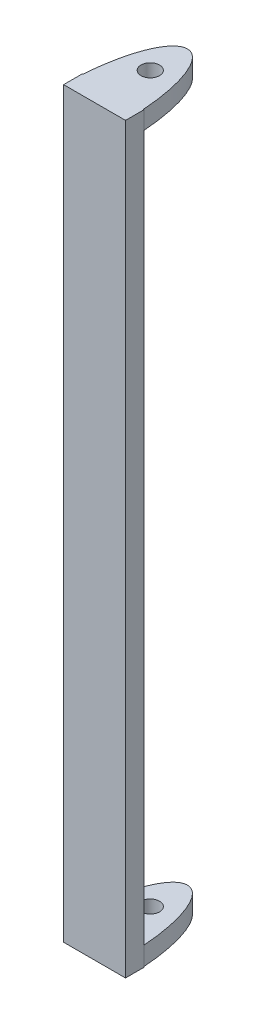
ISO-10303-21;
HEADER;
FILE_DESCRIPTION(('STEP AP214'),'2;1');
FILE_NAME('part.step','',(''),(''),'','','');
FILE_SCHEMA(('AUTOMOTIVE_DESIGN { 1 0 10303 214 1 1 1 1 }'));
ENDSEC;
DATA;
#1=APPLICATION_CONTEXT('core data for automotive mechanical design processes');
#2=APPLICATION_PROTOCOL_DEFINITION('international standard','automotive_design',2000,#1);
#3=PRODUCT_CONTEXT('',#1,'mechanical');
#4=PRODUCT('Part','Part','',(#3));
#5=PRODUCT_RELATED_PRODUCT_CATEGORY('part','',(#4));
#6=PRODUCT_DEFINITION_FORMATION('','',#4);
#7=PRODUCT_DEFINITION_CONTEXT('part definition',#1,'design');
#8=PRODUCT_DEFINITION('design','',#6,#7);
#9=PRODUCT_DEFINITION_SHAPE('','',#8);
#10=(LENGTH_UNIT() NAMED_UNIT(*) SI_UNIT(.MILLI.,.METRE.));
#11=(NAMED_UNIT(*) PLANE_ANGLE_UNIT() SI_UNIT($,.RADIAN.));
#12=(NAMED_UNIT(*) SI_UNIT($,.STERADIAN.) SOLID_ANGLE_UNIT());
#13=UNCERTAINTY_MEASURE_WITH_UNIT(LENGTH_MEASURE(1.E-05),#10,'distance_accuracy_value','');
#14=(GEOMETRIC_REPRESENTATION_CONTEXT(3) GLOBAL_UNCERTAINTY_ASSIGNED_CONTEXT((#13)) GLOBAL_UNIT_ASSIGNED_CONTEXT((#10,
#11,#12)) REPRESENTATION_CONTEXT('',''));
#15=CARTESIAN_POINT('',(0.,0.,0.));
#16=DIRECTION('',(0.,0.,1.));
#17=DIRECTION('',(1.,0.,0.));
#18=AXIS2_PLACEMENT_3D('',#15,#16,#17);
#19=CARTESIAN_POINT('',(5.,3.,0.));
#20=DIRECTION('',(0.,1.,0.));
#21=DIRECTION('',(0.,0.,-1.));
#22=AXIS2_PLACEMENT_3D('',#19,#20,#21);
#23=ELLIPSE('',#22,15.,5.);
#24=DIRECTION('',(0.,-1.,0.));
#25=VECTOR('',#24,1.);
#26=SURFACE_OF_LINEAR_EXTRUSION('',#23,#25);
#27=CARTESIAN_POINT('',(5.,0.,0.));
#28=DIRECTION('',(0.,1.,0.));
#29=DIRECTION('',(0.,0.,-1.));
#30=AXIS2_PLACEMENT_3D('',#27,#28,#29);
#31=ELLIPSE('',#30,15.,5.);
#32=CARTESIAN_POINT('',(9.89897948556636,0.,-3.));
#33=VERTEX_POINT('',#32);
#34=CARTESIAN_POINT('',(0.101020514433644,0.,-3.));
#35=VERTEX_POINT('',#34);
#36=EDGE_CURVE('E173',#33,#35,#31,.T.);
#37=ORIENTED_EDGE('',*,*,#36,.T.);
#38=DIRECTION('',(0.,-1.,0.));
#39=VECTOR('',#38,1.);
#40=CARTESIAN_POINT('',(0.101020514433644,3.,-3.));
#41=LINE('',#40,#39);
#42=CARTESIAN_POINT('',(0.101020514433644,3.,-3.));
#43=VERTEX_POINT('',#42);
#44=EDGE_CURVE('E64',#35,#43,#41,.F.);
#45=ORIENTED_EDGE('',*,*,#44,.T.);
#46=CARTESIAN_POINT('',(9.89897948556636,3.,-3.));
#47=VERTEX_POINT('',#46);
#48=EDGE_CURVE('E176',#47,#43,#23,.T.);
#49=ORIENTED_EDGE('',*,*,#48,.F.);
#50=DIRECTION('',(0.,-1.,0.));
#51=VECTOR('',#50,1.);
#52=CARTESIAN_POINT('',(9.89897948556636,3.,-3.));
#53=LINE('',#52,#51);
#54=EDGE_CURVE('E153',#47,#33,#53,.T.);
#55=ORIENTED_EDGE('',*,*,#54,.T.);
#56=EDGE_LOOP('',(#37,#45,#49,#55));
#57=FACE_BOUND('',#56,.T.);
#58=ADVANCED_FACE('F39',(#57),#26,.F.);
#59=CARTESIAN_POINT('',(0.,3.,0.));
#60=DIRECTION('',(0.,0.,-1.));
#61=DIRECTION('',(-1.,0.,0.));
#62=AXIS2_PLACEMENT_3D('',#59,#60,#61);
#63=PLANE('',#62);
#64=DIRECTION('',(1.,0.,0.));
#65=VECTOR('',#64,1.);
#66=CARTESIAN_POINT('',(10.,-117.,0.));
#67=LINE('',#66,#65);
#68=CARTESIAN_POINT('',(0.,-117.,0.));
#69=VERTEX_POINT('',#68);
#70=CARTESIAN_POINT('',(10.,-117.,0.));
#71=VERTEX_POINT('',#70);
#72=EDGE_CURVE('E125',#69,#71,#67,.T.);
#73=ORIENTED_EDGE('',*,*,#72,.T.);
#74=DIRECTION('',(0.,-1.,0.));
#75=VECTOR('',#74,1.);
#76=CARTESIAN_POINT('',(10.,3.,0.));
#77=LINE('',#76,#75);
#78=CARTESIAN_POINT('',(10.,3.,0.));
#79=VERTEX_POINT('',#78);
#80=EDGE_CURVE('E185',#79,#71,#77,.T.);
#81=ORIENTED_EDGE('',*,*,#80,.F.);
#82=DIRECTION('',(1.,0.,0.));
#83=VECTOR('',#82,1.);
#84=CARTESIAN_POINT('',(0.,3.,0.));
#85=LINE('',#84,#83);
#86=CARTESIAN_POINT('',(0.,3.,0.));
#87=VERTEX_POINT('',#86);
#88=EDGE_CURVE('E181',#87,#79,#85,.T.);
#89=ORIENTED_EDGE('',*,*,#88,.F.);
#90=DIRECTION('',(0.,-1.,0.));
#91=VECTOR('',#90,1.);
#92=CARTESIAN_POINT('',(0.,3.,0.));
#93=LINE('',#92,#91);
#94=EDGE_CURVE('E49',#87,#69,#93,.T.);
#95=ORIENTED_EDGE('',*,*,#94,.T.);
#96=EDGE_LOOP('',(#73,#81,#89,#95));
#97=FACE_BOUND('',#96,.T.);
#98=ADVANCED_FACE('F198',(#97),#63,.F.);
#99=CARTESIAN_POINT('',(5.,3.,0.));
#100=DIRECTION('',(0.,1.,0.));
#101=DIRECTION('',(0.,0.,1.));
#102=AXIS2_PLACEMENT_3D('',#99,#100,#101);
#103=PLANE('',#102);
#104=ORIENTED_EDGE('',*,*,#48,.T.);
#105=DIRECTION('',(-1.,0.,0.));
#106=VECTOR('',#105,1.);
#107=CARTESIAN_POINT('',(10.,3.,-3.));
#108=LINE('',#107,#106);
#109=CARTESIAN_POINT('',(0.,3.,-3.));
#110=VERTEX_POINT('',#109);
#111=EDGE_CURVE('E132',#43,#110,#108,.T.);
#112=ORIENTED_EDGE('',*,*,#111,.T.);
#113=DIRECTION('',(0.,0.,1.));
#114=VECTOR('',#113,1.);
#115=CARTESIAN_POINT('',(0.,3.,-3.));
#116=LINE('',#115,#114);
#117=EDGE_CURVE('E158',#110,#87,#116,.T.);
#118=ORIENTED_EDGE('',*,*,#117,.T.);
#119=ORIENTED_EDGE('',*,*,#88,.T.);
#120=DIRECTION('',(0.,0.,1.));
#121=VECTOR('',#120,1.);
#122=CARTESIAN_POINT('',(10.,3.,-3.));
#123=LINE('',#122,#121);
#124=CARTESIAN_POINT('',(10.,3.,-3.));
#125=VERTEX_POINT('',#124);
#126=EDGE_CURVE('E145',#125,#79,#123,.T.);
#127=ORIENTED_EDGE('',*,*,#126,.F.);
#128=EDGE_CURVE('E133',#125,#47,#108,.T.);
#129=ORIENTED_EDGE('',*,*,#128,.T.);
#130=EDGE_LOOP('',(#104,#112,#118,#119,#127,#129));
#131=FACE_BOUND('',#130,.T.);
#132=CARTESIAN_POINT('',(5.,3.,-9.));
#133=DIRECTION('',(0.,1.,0.));
#134=DIRECTION('',(0.,0.,1.));
#135=AXIS2_PLACEMENT_3D('',#132,#133,#134);
#136=CIRCLE('',#135,1.5);
#137=CARTESIAN_POINT('',(5.,3.,-7.5));
#138=VERTEX_POINT('',#137);
#139=EDGE_CURVE('E168',#138,#138,#136,.T.);
#140=ORIENTED_EDGE('',*,*,#139,.F.);
#141=EDGE_LOOP('',(#140));
#142=FACE_BOUND('',#141,.T.);
#143=ADVANCED_FACE('F214',(#131,#142),#103,.T.);
#144=CARTESIAN_POINT('',(5.,0.,0.));
#145=DIRECTION('',(0.,1.,0.));
#146=DIRECTION('',(0.,0.,1.));
#147=AXIS2_PLACEMENT_3D('',#144,#145,#146);
#148=PLANE('',#147);
#149=CARTESIAN_POINT('',(5.,0.,-9.));
#150=DIRECTION('',(0.,1.,0.));
#151=DIRECTION('',(0.,0.,1.));
#152=AXIS2_PLACEMENT_3D('',#149,#150,#151);
#153=CIRCLE('',#152,1.5);
#154=CARTESIAN_POINT('',(5.,0.,-7.5));
#155=VERTEX_POINT('',#154);
#156=EDGE_CURVE('E169',#155,#155,#153,.T.);
#157=ORIENTED_EDGE('',*,*,#156,.T.);
#158=EDGE_LOOP('',(#157));
#159=FACE_BOUND('',#158,.T.);
#160=ORIENTED_EDGE('',*,*,#36,.F.);
#161=DIRECTION('',(-1.,0.,0.));
#162=VECTOR('',#161,1.);
#163=CARTESIAN_POINT('',(5.,0.,-3.));
#164=LINE('',#163,#162);
#165=EDGE_CURVE('E11',#33,#35,#164,.T.);
#166=ORIENTED_EDGE('',*,*,#165,.T.);
#167=EDGE_LOOP('',(#160,#166));
#168=FACE_BOUND('',#167,.T.);
#169=ADVANCED_FACE('F219',(#159,#168),#148,.F.);
#170=CARTESIAN_POINT('',(5.,0.,-9.));
#171=DIRECTION('',(0.,1.,0.));
#172=DIRECTION('',(0.,0.,1.));
#173=AXIS2_PLACEMENT_3D('',#170,#171,#172);
#174=CYLINDRICAL_SURFACE('',#173,1.5);
#175=ORIENTED_EDGE('',*,*,#156,.F.);
#176=EDGE_LOOP('',(#175));
#177=FACE_BOUND('',#176,.T.);
#178=ORIENTED_EDGE('',*,*,#139,.T.);
#179=EDGE_LOOP('',(#178));
#180=FACE_BOUND('',#179,.T.);
#181=ADVANCED_FACE('F221',(#177,#180),#174,.F.);
#182=CARTESIAN_POINT('',(0.,0.,-3.));
#183=DIRECTION('',(0.,0.,-1.));
#184=DIRECTION('',(-1.,0.,0.));
#185=AXIS2_PLACEMENT_3D('',#182,#183,#184);
#186=PLANE('',#185);
#187=DIRECTION('',(0.,1.,0.));
#188=VECTOR('',#187,1.);
#189=CARTESIAN_POINT('',(0.101020514433644,-117.,-3.));
#190=LINE('',#189,#188);
#191=CARTESIAN_POINT('',(0.101020514433644,-117.,-3.));
#192=VERTEX_POINT('',#191);
#193=CARTESIAN_POINT('',(0.101020514433644,-114.,-3.));
#194=VERTEX_POINT('',#193);
#195=EDGE_CURVE('E115',#192,#194,#190,.T.);
#196=ORIENTED_EDGE('',*,*,#195,.F.);
#197=DIRECTION('',(1.,0.,0.));
#198=VECTOR('',#197,1.);
#199=CARTESIAN_POINT('',(10.,-117.,-3.));
#200=LINE('',#199,#198);
#201=CARTESIAN_POINT('',(0.,-117.,-3.));
#202=VERTEX_POINT('',#201);
#203=EDGE_CURVE('E141',#202,#192,#200,.T.);
#204=ORIENTED_EDGE('',*,*,#203,.F.);
#205=DIRECTION('',(0.,-1.,0.));
#206=VECTOR('',#205,1.);
#207=CARTESIAN_POINT('',(0.,3.,-3.));
#208=LINE('',#207,#206);
#209=EDGE_CURVE('E137',#110,#202,#208,.T.);
#210=ORIENTED_EDGE('',*,*,#209,.F.);
#211=ORIENTED_EDGE('',*,*,#111,.F.);
#212=ORIENTED_EDGE('',*,*,#44,.F.);
#213=ORIENTED_EDGE('',*,*,#165,.F.);
#214=ORIENTED_EDGE('',*,*,#54,.F.);
#215=ORIENTED_EDGE('',*,*,#128,.F.);
#216=DIRECTION('',(0.,1.,0.));
#217=VECTOR('',#216,1.);
#218=CARTESIAN_POINT('',(10.,3.,-3.));
#219=LINE('',#218,#217);
#220=CARTESIAN_POINT('',(10.,-117.,-3.));
#221=VERTEX_POINT('',#220);
#222=EDGE_CURVE('E128',#221,#125,#219,.T.);
#223=ORIENTED_EDGE('',*,*,#222,.F.);
#224=CARTESIAN_POINT('',(9.89897948556636,-117.,-3.));
#225=VERTEX_POINT('',#224);
#226=EDGE_CURVE('E121',#225,#221,#200,.T.);
#227=ORIENTED_EDGE('',*,*,#226,.F.);
#228=DIRECTION('',(0.,1.,0.));
#229=VECTOR('',#228,1.);
#230=CARTESIAN_POINT('',(9.89897948556636,-117.,-3.));
#231=LINE('',#230,#229);
#232=CARTESIAN_POINT('',(9.89897948556636,-114.,-3.));
#233=VERTEX_POINT('',#232);
#234=EDGE_CURVE('E109',#233,#225,#231,.F.);
#235=ORIENTED_EDGE('',*,*,#234,.F.);
#236=DIRECTION('',(-1.,0.,0.));
#237=VECTOR('',#236,1.);
#238=CARTESIAN_POINT('',(0.,-114.,-3.));
#239=LINE('',#238,#237);
#240=EDGE_CURVE('E104',#233,#194,#239,.T.);
#241=ORIENTED_EDGE('',*,*,#240,.T.);
#242=EDGE_LOOP('',(#196,#204,#210,#211,#212,#213,#214,#215,#223,#227,#235,#241));
#243=FACE_BOUND('',#242,.T.);
#244=ADVANCED_FACE('F119',(#243),#186,.T.);
#245=CARTESIAN_POINT('',(10.,3.,-3.));
#246=DIRECTION('',(1.,0.,0.));
#247=DIRECTION('',(0.,1.,0.));
#248=AXIS2_PLACEMENT_3D('',#245,#246,#247);
#249=PLANE('',#248);
#250=ORIENTED_EDGE('',*,*,#80,.T.);
#251=DIRECTION('',(0.,0.,1.));
#252=VECTOR('',#251,1.);
#253=CARTESIAN_POINT('',(10.,-117.,-3.));
#254=LINE('',#253,#252);
#255=EDGE_CURVE('E149',#221,#71,#254,.T.);
#256=ORIENTED_EDGE('',*,*,#255,.F.);
#257=ORIENTED_EDGE('',*,*,#222,.T.);
#258=ORIENTED_EDGE('',*,*,#126,.T.);
#259=EDGE_LOOP('',(#250,#256,#257,#258));
#260=FACE_BOUND('',#259,.T.);
#261=ADVANCED_FACE('F210',(#260),#249,.T.);
#262=CARTESIAN_POINT('',(10.,-117.,-3.));
#263=DIRECTION('',(0.,-1.,0.));
#264=DIRECTION('',(0.,0.,-1.));
#265=AXIS2_PLACEMENT_3D('',#262,#263,#264);
#266=PLANE('',#265);
#267=CARTESIAN_POINT('',(5.,-117.,-9.));
#268=DIRECTION('',(0.,1.,0.));
#269=DIRECTION('',(0.,0.,1.));
#270=AXIS2_PLACEMENT_3D('',#267,#268,#269);
#271=CIRCLE('',#270,1.5);
#272=CARTESIAN_POINT('',(5.,-117.,-10.5));
#273=VERTEX_POINT('',#272);
#274=EDGE_CURVE('E336',#273,#273,#271,.T.);
#275=ORIENTED_EDGE('',*,*,#274,.T.);
#276=EDGE_LOOP('',(#275));
#277=FACE_BOUND('',#276,.T.);
#278=ORIENTED_EDGE('',*,*,#203,.T.);
#279=CARTESIAN_POINT('',(5.,-117.,0.));
#280=DIRECTION('',(0.,1.,0.));
#281=DIRECTION('',(0.,0.,-1.));
#282=AXIS2_PLACEMENT_3D('',#279,#280,#281);
#283=ELLIPSE('',#282,15.,5.);
#284=EDGE_CURVE('E110',#225,#192,#283,.T.);
#285=ORIENTED_EDGE('',*,*,#284,.F.);
#286=ORIENTED_EDGE('',*,*,#226,.T.);
#287=ORIENTED_EDGE('',*,*,#255,.T.);
#288=ORIENTED_EDGE('',*,*,#72,.F.);
#289=DIRECTION('',(0.,0.,1.));
#290=VECTOR('',#289,1.);
#291=CARTESIAN_POINT('',(0.,-117.,-3.));
#292=LINE('',#291,#290);
#293=EDGE_CURVE('E154',#202,#69,#292,.T.);
#294=ORIENTED_EDGE('',*,*,#293,.F.);
#295=EDGE_LOOP('',(#278,#285,#286,#287,#288,#294));
#296=FACE_BOUND('',#295,.T.);
#297=ADVANCED_FACE('F207',(#277,#296),#266,.T.);
#298=CARTESIAN_POINT('',(0.,3.,-3.));
#299=DIRECTION('',(-1.,0.,0.));
#300=DIRECTION('',(0.,-1.,0.));
#301=AXIS2_PLACEMENT_3D('',#298,#299,#300);
#302=PLANE('',#301);
#303=ORIENTED_EDGE('',*,*,#94,.F.);
#304=ORIENTED_EDGE('',*,*,#117,.F.);
#305=ORIENTED_EDGE('',*,*,#209,.T.);
#306=ORIENTED_EDGE('',*,*,#293,.T.);
#307=EDGE_LOOP('',(#303,#304,#305,#306));
#308=FACE_BOUND('',#307,.T.);
#309=ADVANCED_FACE('F203',(#308),#302,.T.);
#310=DIRECTION('',(0.,1.,0.));
#311=VECTOR('',#310,1.);
#312=SURFACE_OF_LINEAR_EXTRUSION('',#283,#311);
#313=ORIENTED_EDGE('',*,*,#284,.T.);
#314=ORIENTED_EDGE('',*,*,#195,.T.);
#315=CARTESIAN_POINT('',(5.,-114.,0.));
#316=DIRECTION('',(0.,1.,0.));
#317=DIRECTION('',(0.,0.,-1.));
#318=AXIS2_PLACEMENT_3D('',#315,#316,#317);
#319=ELLIPSE('',#318,15.,5.);
#320=EDGE_CURVE('E56',#233,#194,#319,.T.);
#321=ORIENTED_EDGE('',*,*,#320,.F.);
#322=ORIENTED_EDGE('',*,*,#234,.T.);
#323=EDGE_LOOP('',(#313,#314,#321,#322));
#324=FACE_BOUND('',#323,.T.);
#325=ADVANCED_FACE('F113',(#324),#312,.T.);
#326=CARTESIAN_POINT('',(5.,-114.,0.));
#327=DIRECTION('',(0.,-1.,0.));
#328=DIRECTION('',(0.,0.,1.));
#329=AXIS2_PLACEMENT_3D('',#326,#327,#328);
#330=PLANE('',#329);
#331=CARTESIAN_POINT('',(5.,-114.,-9.));
#332=DIRECTION('',(0.,-1.,0.));
#333=DIRECTION('',(0.,0.,-1.));
#334=AXIS2_PLACEMENT_3D('',#331,#332,#333);
#335=CIRCLE('',#334,1.5);
#336=CARTESIAN_POINT('',(5.,-114.,-10.5));
#337=VERTEX_POINT('',#336);
#338=EDGE_CURVE('E43',#337,#337,#335,.F.);
#339=ORIENTED_EDGE('',*,*,#338,.F.);
#340=EDGE_LOOP('',(#339));
#341=FACE_BOUND('',#340,.T.);
#342=ORIENTED_EDGE('',*,*,#240,.F.);
#343=ORIENTED_EDGE('',*,*,#320,.T.);
#344=EDGE_LOOP('',(#342,#343));
#345=FACE_BOUND('',#344,.T.);
#346=ADVANCED_FACE('F105',(#341,#345),#330,.F.);
#347=CARTESIAN_POINT('',(5.,3.000025,-9.));
#348=DIRECTION('',(0.,-1.,0.));
#349=DIRECTION('',(0.,0.,-1.));
#350=AXIS2_PLACEMENT_3D('',#347,#348,#349);
#351=CYLINDRICAL_SURFACE('',#350,1.5);
#352=CARTESIAN_POINT('',(5.,-117.,-10.5));
#353=CARTESIAN_POINT('',(5.,-116.96875,-10.5));
#354=CARTESIAN_POINT('',(5.,-116.9375,-10.5));
#355=CARTESIAN_POINT('',(5.,-116.875,-10.5));
#356=CARTESIAN_POINT('',(5.,-116.84375,-10.5));
#357=CARTESIAN_POINT('',(5.,-116.78125,-10.5));
#358=CARTESIAN_POINT('',(5.,-116.75,-10.5));
#359=CARTESIAN_POINT('',(5.,-116.6875,-10.5));
#360=CARTESIAN_POINT('',(5.,-116.65625,-10.5));
#361=CARTESIAN_POINT('',(5.,-116.59375,-10.5));
#362=CARTESIAN_POINT('',(5.,-116.5625,-10.5));
#363=CARTESIAN_POINT('',(5.,-116.5,-10.5));
#364=CARTESIAN_POINT('',(5.,-116.46875,-10.5));
#365=CARTESIAN_POINT('',(5.,-116.40625,-10.5));
#366=CARTESIAN_POINT('',(5.,-116.375,-10.5));
#367=CARTESIAN_POINT('',(5.,-116.3125,-10.5));
#368=CARTESIAN_POINT('',(5.,-116.28125,-10.5));
#369=CARTESIAN_POINT('',(5.,-116.21875,-10.5));
#370=CARTESIAN_POINT('',(5.,-116.1875,-10.5));
#371=CARTESIAN_POINT('',(5.,-116.125,-10.5));
#372=CARTESIAN_POINT('',(5.,-116.09375,-10.5));
#373=CARTESIAN_POINT('',(5.,-116.03125,-10.5));
#374=CARTESIAN_POINT('',(5.,-116.,-10.5));
#375=CARTESIAN_POINT('',(5.,-115.9375,-10.5));
#376=CARTESIAN_POINT('',(5.,-115.90625,-10.5));
#377=CARTESIAN_POINT('',(5.,-115.84375,-10.5));
#378=CARTESIAN_POINT('',(5.,-115.8125,-10.5));
#379=CARTESIAN_POINT('',(5.,-115.75,-10.5));
#380=CARTESIAN_POINT('',(5.,-115.71875,-10.5));
#381=CARTESIAN_POINT('',(5.,-115.65625,-10.5));
#382=CARTESIAN_POINT('',(5.,-115.625,-10.5));
#383=CARTESIAN_POINT('',(5.,-115.5625,-10.5));
#384=CARTESIAN_POINT('',(5.,-115.53125,-10.5));
#385=CARTESIAN_POINT('',(5.,-115.46875,-10.5));
#386=CARTESIAN_POINT('',(5.,-115.4375,-10.5));
#387=CARTESIAN_POINT('',(5.,-115.375,-10.5));
#388=CARTESIAN_POINT('',(5.,-115.34375,-10.5));
#389=CARTESIAN_POINT('',(5.,-115.28125,-10.5));
#390=CARTESIAN_POINT('',(5.,-115.25,-10.5));
#391=CARTESIAN_POINT('',(5.,-115.1875,-10.5));
#392=CARTESIAN_POINT('',(5.,-115.15625,-10.5));
#393=CARTESIAN_POINT('',(5.,-115.09375,-10.5));
#394=CARTESIAN_POINT('',(5.,-115.0625,-10.5));
#395=CARTESIAN_POINT('',(5.,-115.,-10.5));
#396=CARTESIAN_POINT('',(5.,-114.96875,-10.5));
#397=CARTESIAN_POINT('',(5.,-114.90625,-10.5));
#398=CARTESIAN_POINT('',(5.,-114.875,-10.5));
#399=CARTESIAN_POINT('',(5.,-114.8125,-10.5));
#400=CARTESIAN_POINT('',(5.,-114.78125,-10.5));
#401=CARTESIAN_POINT('',(5.,-114.71875,-10.5));
#402=CARTESIAN_POINT('',(5.,-114.6875,-10.5));
#403=CARTESIAN_POINT('',(5.,-114.625,-10.5));
#404=CARTESIAN_POINT('',(5.,-114.59375,-10.5));
#405=CARTESIAN_POINT('',(5.,-114.53125,-10.5));
#406=CARTESIAN_POINT('',(5.,-114.5,-10.5));
#407=CARTESIAN_POINT('',(5.,-114.4375,-10.5));
#408=CARTESIAN_POINT('',(5.,-114.40625,-10.5));
#409=CARTESIAN_POINT('',(5.,-114.34375,-10.5));
#410=CARTESIAN_POINT('',(5.,-114.3125,-10.5));
#411=CARTESIAN_POINT('',(5.,-114.25,-10.5));
#412=CARTESIAN_POINT('',(5.,-114.21875,-10.5));
#413=CARTESIAN_POINT('',(5.,-114.15625,-10.5));
#414=CARTESIAN_POINT('',(5.,-114.125,-10.5));
#415=CARTESIAN_POINT('',(5.,-114.0625,-10.5));
#416=CARTESIAN_POINT('',(5.,-114.03125,-10.5));
#417=CARTESIAN_POINT('',(5.,-114.,-10.5));
#418=B_SPLINE_CURVE_WITH_KNOTS('',3,(#352,#353,#354,#355,#356,#357,#358,#359,#360,#361,#362,
#363,#364,#365,#366,#367,#368,#369,#370,#371,#372,#373,#374,#375,#376,#377,#378,#379,#380,#381,
#382,#383,#384,#385,#386,#387,#388,#389,#390,#391,#392,#393,#394,#395,#396,#397,#398,#399,#400,
#401,#402,#403,#404,#405,#406,#407,#408,#409,#410,#411,#412,#413,#414,#415,#416,#417),
.UNSPECIFIED.,.F.,.F.,(4,2,2,2,2,2,2,2,2,2,2,2,2,2,2,2,2,2,2,2,2,2,2,2,2,2,2,2,2,2,2,2,4),(0.,
0.0937500000000036,0.187500000000007,0.281249999999997,0.375,0.468750000000004,
0.562499999999994,0.656249999999997,0.750000000000001,0.843750000000004,0.937500000000008,
1.03125,1.125,1.21875,1.31249999999999,1.40625,1.5,1.59375,1.68750000000001,1.78125,1.875,
1.96875000000001,2.06249999999999,2.15625,2.25,2.34375000000001,2.43750000000001,2.53125,2.625,
2.71875000000001,2.8125,2.90625,3.),.UNSPECIFIED.);
#419=EDGE_CURVE('BSEAM302',#273,#337,#418,.T.);
#420=ORIENTED_EDGE('',*,*,#274,.F.);
#421=ORIENTED_EDGE('',*,*,#338,.T.);
#422=ORIENTED_EDGE('',*,*,#419,.T.);
#423=ORIENTED_EDGE('',*,*,#419,.F.);
#424=EDGE_LOOP('',(#420,#422,#421,#423));
#425=FACE_BOUND('',#424,.T.);
#426=ADVANCED_FACE('F302',(#425),#351,.F.);
#427=CLOSED_SHELL('',(#58,#98,#143,#169,#181,#244,#261,#297,#309,#325,#346,#426));
#428=MANIFOLD_SOLID_BREP('B2',#427);
#429=ADVANCED_BREP_SHAPE_REPRESENTATION('',(#18,#428),#14);
#430=SHAPE_DEFINITION_REPRESENTATION(#9,#429);
ENDSEC;
END-ISO-10303-21;
